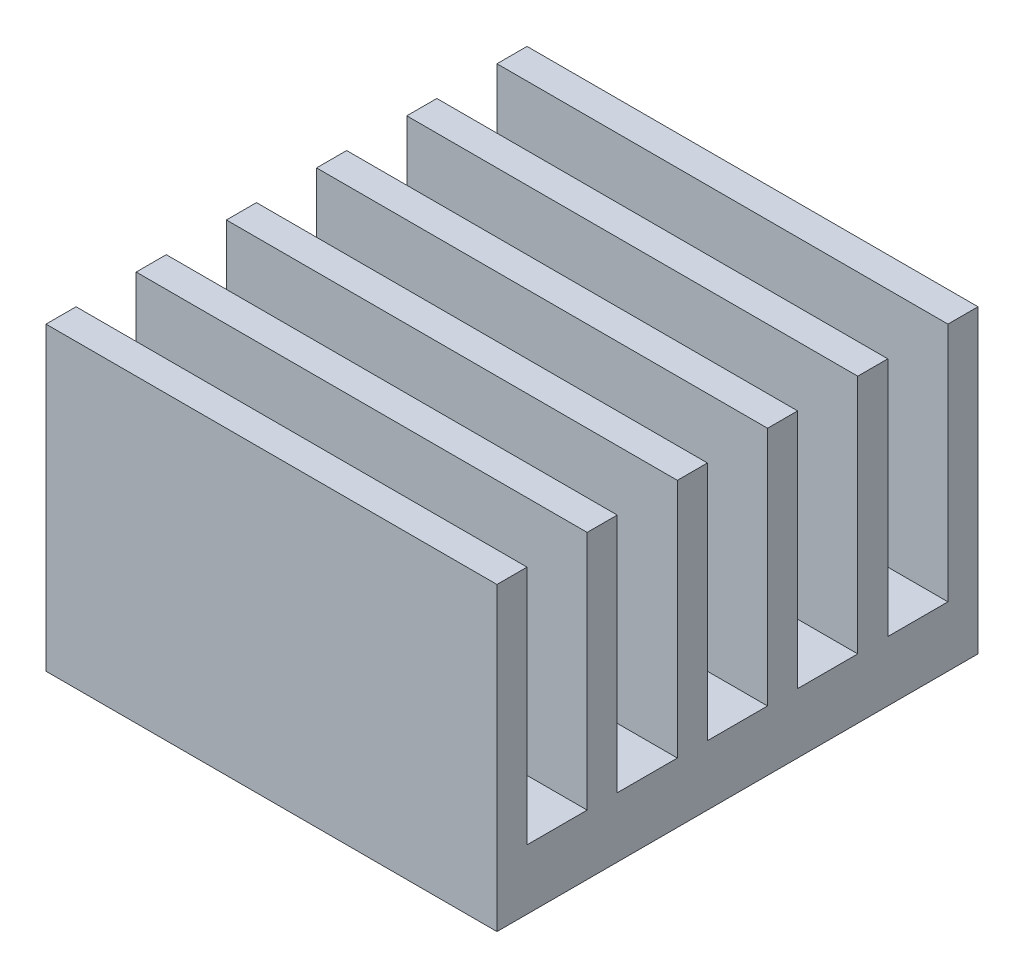
ISO-10303-21;
HEADER;
FILE_DESCRIPTION(('STEP AP214'),'2;1');
FILE_NAME('part.step','',(''),(''),'','','');
FILE_SCHEMA(('AUTOMOTIVE_DESIGN { 1 0 10303 214 1 1 1 1 }'));
ENDSEC;
DATA;
#1=APPLICATION_CONTEXT('core data for automotive mechanical design processes');
#2=APPLICATION_PROTOCOL_DEFINITION('international standard','automotive_design',2000,#1);
#3=PRODUCT_CONTEXT('',#1,'mechanical');
#4=PRODUCT('Part','Part','',(#3));
#5=PRODUCT_RELATED_PRODUCT_CATEGORY('part','',(#4));
#6=PRODUCT_DEFINITION_FORMATION('','',#4);
#7=PRODUCT_DEFINITION_CONTEXT('part definition',#1,'design');
#8=PRODUCT_DEFINITION('design','',#6,#7);
#9=PRODUCT_DEFINITION_SHAPE('','',#8);
#10=(LENGTH_UNIT() NAMED_UNIT(*) SI_UNIT(.MILLI.,.METRE.));
#11=(NAMED_UNIT(*) PLANE_ANGLE_UNIT() SI_UNIT($,.RADIAN.));
#12=(NAMED_UNIT(*) SI_UNIT($,.STERADIAN.) SOLID_ANGLE_UNIT());
#13=UNCERTAINTY_MEASURE_WITH_UNIT(LENGTH_MEASURE(1.E-05),#10,'distance_accuracy_value','');
#14=(GEOMETRIC_REPRESENTATION_CONTEXT(3) GLOBAL_UNCERTAINTY_ASSIGNED_CONTEXT((#13)) GLOBAL_UNIT_ASSIGNED_CONTEXT((#10,
#11,#12)) REPRESENTATION_CONTEXT('',''));
#15=CARTESIAN_POINT('',(0.,0.,0.));
#16=DIRECTION('',(0.,0.,1.));
#17=DIRECTION('',(1.,0.,0.));
#18=AXIS2_PLACEMENT_3D('',#15,#16,#17);
#19=CARTESIAN_POINT('',(0.,50.,0.));
#20=DIRECTION('',(0.,1.,0.));
#21=DIRECTION('',(0.,0.,1.));
#22=AXIS2_PLACEMENT_3D('',#19,#20,#21);
#23=PLANE('',#22);
#24=DIRECTION('',(-1.,0.,0.));
#25=VECTOR('',#24,1.);
#26=CARTESIAN_POINT('',(-37.5,50.,-35.));
#27=LINE('',#26,#25);
#28=CARTESIAN_POINT('',(37.5,50.,-35.));
#29=VERTEX_POINT('',#28);
#30=CARTESIAN_POINT('',(-37.5,50.,-35.));
#31=VERTEX_POINT('',#30);
#32=EDGE_CURVE('E221',#29,#31,#27,.T.);
#33=ORIENTED_EDGE('',*,*,#32,.F.);
#34=DIRECTION('',(0.,0.,-1.));
#35=VECTOR('',#34,1.);
#36=CARTESIAN_POINT('',(37.5,50.,40.));
#37=LINE('',#36,#35);
#38=CARTESIAN_POINT('',(37.5,50.,-40.));
#39=VERTEX_POINT('',#38);
#40=EDGE_CURVE('E337',#29,#39,#37,.T.);
#41=ORIENTED_EDGE('',*,*,#40,.T.);
#42=DIRECTION('',(-1.,0.,0.));
#43=VECTOR('',#42,1.);
#44=CARTESIAN_POINT('',(37.5,50.,-40.));
#45=LINE('',#44,#43);
#46=CARTESIAN_POINT('',(-37.5,50.,-40.));
#47=VERTEX_POINT('',#46);
#48=EDGE_CURVE('E341',#39,#47,#45,.T.);
#49=ORIENTED_EDGE('',*,*,#48,.T.);
#50=DIRECTION('',(0.,0.,1.));
#51=VECTOR('',#50,1.);
#52=CARTESIAN_POINT('',(-37.5,50.,40.));
#53=LINE('',#52,#51);
#54=EDGE_CURVE('E331',#47,#31,#53,.T.);
#55=ORIENTED_EDGE('',*,*,#54,.T.);
#56=EDGE_LOOP('',(#33,#41,#49,#55));
#57=FACE_BOUND('',#56,.T.);
#58=ADVANCED_FACE('F41',(#57),#23,.T.);
#59=DIRECTION('',(1.,0.,0.));
#60=VECTOR('',#59,1.);
#61=CARTESIAN_POINT('',(-37.5,50.,-25.));
#62=LINE('',#61,#60);
#63=CARTESIAN_POINT('',(-37.5,50.,-25.));
#64=VERTEX_POINT('',#63);
#65=CARTESIAN_POINT('',(37.5,50.,-25.));
#66=VERTEX_POINT('',#65);
#67=EDGE_CURVE('E249',#64,#66,#62,.T.);
#68=ORIENTED_EDGE('',*,*,#67,.F.);
#69=CARTESIAN_POINT('',(-37.5,50.,-20.));
#70=VERTEX_POINT('',#69);
#71=EDGE_CURVE('E226',#64,#70,#53,.T.);
#72=ORIENTED_EDGE('',*,*,#71,.T.);
#73=DIRECTION('',(-1.,0.,0.));
#74=VECTOR('',#73,1.);
#75=CARTESIAN_POINT('',(-37.5,50.,-20.));
#76=LINE('',#75,#74);
#77=CARTESIAN_POINT('',(37.5,50.,-20.));
#78=VERTEX_POINT('',#77);
#79=EDGE_CURVE('E244',#78,#70,#76,.T.);
#80=ORIENTED_EDGE('',*,*,#79,.F.);
#81=EDGE_CURVE('E382',#78,#66,#37,.T.);
#82=ORIENTED_EDGE('',*,*,#81,.T.);
#83=EDGE_LOOP('',(#68,#72,#80,#82));
#84=FACE_BOUND('',#83,.T.);
#85=ADVANCED_FACE('F432',(#84),#23,.T.);
#86=DIRECTION('',(1.,0.,0.));
#87=VECTOR('',#86,1.);
#88=CARTESIAN_POINT('',(-37.5,50.,-10.));
#89=LINE('',#88,#87);
#90=CARTESIAN_POINT('',(-37.5,50.,-10.));
#91=VERTEX_POINT('',#90);
#92=CARTESIAN_POINT('',(37.5,50.,-10.));
#93=VERTEX_POINT('',#92);
#94=EDGE_CURVE('E246',#91,#93,#89,.T.);
#95=ORIENTED_EDGE('',*,*,#94,.F.);
#96=CARTESIAN_POINT('',(-37.5,50.,-5.00000000000001));
#97=VERTEX_POINT('',#96);
#98=EDGE_CURVE('E419',#91,#97,#53,.T.);
#99=ORIENTED_EDGE('',*,*,#98,.T.);
#100=DIRECTION('',(-1.,0.,0.));
#101=VECTOR('',#100,1.);
#102=CARTESIAN_POINT('',(-37.5,50.,-5.00000000000001));
#103=LINE('',#102,#101);
#104=CARTESIAN_POINT('',(37.5,50.,-5.));
#105=VERTEX_POINT('',#104);
#106=EDGE_CURVE('E271',#105,#97,#103,.T.);
#107=ORIENTED_EDGE('',*,*,#106,.F.);
#108=EDGE_CURVE('E384',#105,#93,#37,.T.);
#109=ORIENTED_EDGE('',*,*,#108,.T.);
#110=EDGE_LOOP('',(#95,#99,#107,#109));
#111=FACE_BOUND('',#110,.T.);
#112=ADVANCED_FACE('F438',(#111),#23,.T.);
#113=DIRECTION('',(1.,0.,0.));
#114=VECTOR('',#113,1.);
#115=CARTESIAN_POINT('',(-37.5,50.,4.99999999999999));
#116=LINE('',#115,#114);
#117=CARTESIAN_POINT('',(-37.5,50.,4.99999999999999));
#118=VERTEX_POINT('',#117);
#119=CARTESIAN_POINT('',(37.5,50.,4.99999999999999));
#120=VERTEX_POINT('',#119);
#121=EDGE_CURVE('E243',#118,#120,#116,.T.);
#122=ORIENTED_EDGE('',*,*,#121,.F.);
#123=CARTESIAN_POINT('',(-37.5,50.,9.99999999999999));
#124=VERTEX_POINT('',#123);
#125=EDGE_CURVE('E417',#118,#124,#53,.T.);
#126=ORIENTED_EDGE('',*,*,#125,.T.);
#127=DIRECTION('',(-1.,0.,0.));
#128=VECTOR('',#127,1.);
#129=CARTESIAN_POINT('',(-37.5,50.,9.99999999999999));
#130=LINE('',#129,#128);
#131=CARTESIAN_POINT('',(37.5,50.,9.99999999999999));
#132=VERTEX_POINT('',#131);
#133=EDGE_CURVE('E295',#132,#124,#130,.T.);
#134=ORIENTED_EDGE('',*,*,#133,.F.);
#135=EDGE_CURVE('E389',#132,#120,#37,.T.);
#136=ORIENTED_EDGE('',*,*,#135,.T.);
#137=EDGE_LOOP('',(#122,#126,#134,#136));
#138=FACE_BOUND('',#137,.T.);
#139=ADVANCED_FACE('F448',(#138),#23,.T.);
#140=DIRECTION('',(1.,0.,0.));
#141=VECTOR('',#140,1.);
#142=CARTESIAN_POINT('',(-37.5,50.,20.));
#143=LINE('',#142,#141);
#144=CARTESIAN_POINT('',(-37.5,50.,20.));
#145=VERTEX_POINT('',#144);
#146=CARTESIAN_POINT('',(37.5,50.,20.));
#147=VERTEX_POINT('',#146);
#148=EDGE_CURVE('E270',#145,#147,#143,.T.);
#149=ORIENTED_EDGE('',*,*,#148,.F.);
#150=CARTESIAN_POINT('',(-37.5,50.,25.));
#151=VERTEX_POINT('',#150);
#152=EDGE_CURVE('E415',#145,#151,#53,.T.);
#153=ORIENTED_EDGE('',*,*,#152,.T.);
#154=DIRECTION('',(-1.,0.,0.));
#155=VECTOR('',#154,1.);
#156=CARTESIAN_POINT('',(-37.5,50.,25.));
#157=LINE('',#156,#155);
#158=CARTESIAN_POINT('',(37.5,50.,25.));
#159=VERTEX_POINT('',#158);
#160=EDGE_CURVE('E318',#159,#151,#157,.T.);
#161=ORIENTED_EDGE('',*,*,#160,.F.);
#162=EDGE_CURVE('E342',#159,#147,#37,.T.);
#163=ORIENTED_EDGE('',*,*,#162,.T.);
#164=EDGE_LOOP('',(#149,#153,#161,#163));
#165=FACE_BOUND('',#164,.T.);
#166=ADVANCED_FACE('F403',(#165),#23,.T.);
#167=CARTESIAN_POINT('',(-37.5,50.,40.));
#168=DIRECTION('',(1.,0.,0.));
#169=DIRECTION('',(0.,0.,-1.));
#170=AXIS2_PLACEMENT_3D('',#167,#168,#169);
#171=PLANE('',#170);
#172=DIRECTION('',(0.,0.,1.));
#173=VECTOR('',#172,1.);
#174=CARTESIAN_POINT('',(-37.5,10.,-25.));
#175=LINE('',#174,#173);
#176=CARTESIAN_POINT('',(-37.5,10.,-35.));
#177=VERTEX_POINT('',#176);
#178=CARTESIAN_POINT('',(-37.5,10.,-25.));
#179=VERTEX_POINT('',#178);
#180=EDGE_CURVE('E212',#177,#179,#175,.T.);
#181=ORIENTED_EDGE('',*,*,#180,.F.);
#182=DIRECTION('',(0.,1.,0.));
#183=VECTOR('',#182,1.);
#184=CARTESIAN_POINT('',(-37.5,10.,-35.));
#185=LINE('',#184,#183);
#186=EDGE_CURVE('E349',#177,#31,#185,.T.);
#187=ORIENTED_EDGE('',*,*,#186,.T.);
#188=ORIENTED_EDGE('',*,*,#54,.F.);
#189=DIRECTION('',(0.,-1.,0.));
#190=VECTOR('',#189,1.);
#191=CARTESIAN_POINT('',(-37.5,50.,-40.));
#192=LINE('',#191,#190);
#193=CARTESIAN_POINT('',(-37.5,0.,-40.));
#194=VERTEX_POINT('',#193);
#195=EDGE_CURVE('E344',#47,#194,#192,.T.);
#196=ORIENTED_EDGE('',*,*,#195,.T.);
#197=DIRECTION('',(0.,0.,1.));
#198=VECTOR('',#197,1.);
#199=CARTESIAN_POINT('',(-37.5,0.,40.));
#200=LINE('',#199,#198);
#201=CARTESIAN_POINT('',(-37.5,0.,40.));
#202=VERTEX_POINT('',#201);
#203=EDGE_CURVE('E345',#194,#202,#200,.T.);
#204=ORIENTED_EDGE('',*,*,#203,.T.);
#205=DIRECTION('',(0.,-1.,0.));
#206=VECTOR('',#205,1.);
#207=CARTESIAN_POINT('',(-37.5,50.,40.));
#208=LINE('',#207,#206);
#209=CARTESIAN_POINT('',(-37.5,50.,40.));
#210=VERTEX_POINT('',#209);
#211=EDGE_CURVE('E11',#210,#202,#208,.T.);
#212=ORIENTED_EDGE('',*,*,#211,.F.);
#213=CARTESIAN_POINT('',(-37.5,50.,35.));
#214=VERTEX_POINT('',#213);
#215=EDGE_CURVE('E335',#214,#210,#53,.T.);
#216=ORIENTED_EDGE('',*,*,#215,.F.);
#217=DIRECTION('',(0.,1.,0.));
#218=VECTOR('',#217,1.);
#219=CARTESIAN_POINT('',(-37.5,10.,35.));
#220=LINE('',#219,#218);
#221=CARTESIAN_POINT('',(-37.5,10.,35.));
#222=VERTEX_POINT('',#221);
#223=EDGE_CURVE('E56',#222,#214,#220,.T.);
#224=ORIENTED_EDGE('',*,*,#223,.F.);
#225=DIRECTION('',(0.,0.,1.));
#226=VECTOR('',#225,1.);
#227=CARTESIAN_POINT('',(-37.5,10.,35.));
#228=LINE('',#227,#226);
#229=CARTESIAN_POINT('',(-37.5,10.,25.));
#230=VERTEX_POINT('',#229);
#231=EDGE_CURVE('E320',#230,#222,#228,.T.);
#232=ORIENTED_EDGE('',*,*,#231,.F.);
#233=DIRECTION('',(0.,1.,0.));
#234=VECTOR('',#233,1.);
#235=CARTESIAN_POINT('',(-37.5,10.,25.));
#236=LINE('',#235,#234);
#237=EDGE_CURVE('E315',#230,#151,#236,.T.);
#238=ORIENTED_EDGE('',*,*,#237,.T.);
#239=ORIENTED_EDGE('',*,*,#152,.F.);
#240=DIRECTION('',(0.,1.,0.));
#241=VECTOR('',#240,1.);
#242=CARTESIAN_POINT('',(-37.5,10.,20.));
#243=LINE('',#242,#241);
#244=CARTESIAN_POINT('',(-37.5,10.,20.));
#245=VERTEX_POINT('',#244);
#246=EDGE_CURVE('E64',#245,#145,#243,.T.);
#247=ORIENTED_EDGE('',*,*,#246,.F.);
#248=DIRECTION('',(0.,0.,1.));
#249=VECTOR('',#248,1.);
#250=CARTESIAN_POINT('',(-37.5,10.,20.));
#251=LINE('',#250,#249);
#252=CARTESIAN_POINT('',(-37.5,10.,9.99999999999999));
#253=VERTEX_POINT('',#252);
#254=EDGE_CURVE('E297',#253,#245,#251,.T.);
#255=ORIENTED_EDGE('',*,*,#254,.F.);
#256=DIRECTION('',(0.,1.,0.));
#257=VECTOR('',#256,1.);
#258=CARTESIAN_POINT('',(-37.5,10.,9.99999999999999));
#259=LINE('',#258,#257);
#260=EDGE_CURVE('E291',#253,#124,#259,.T.);
#261=ORIENTED_EDGE('',*,*,#260,.T.);
#262=ORIENTED_EDGE('',*,*,#125,.F.);
#263=DIRECTION('',(0.,1.,0.));
#264=VECTOR('',#263,1.);
#265=CARTESIAN_POINT('',(-37.5,10.,4.99999999999999));
#266=LINE('',#265,#264);
#267=CARTESIAN_POINT('',(-37.5,10.,4.99999999999999));
#268=VERTEX_POINT('',#267);
#269=EDGE_CURVE('E259',#268,#118,#266,.T.);
#270=ORIENTED_EDGE('',*,*,#269,.F.);
#271=DIRECTION('',(0.,0.,1.));
#272=VECTOR('',#271,1.);
#273=CARTESIAN_POINT('',(-37.5,10.,4.99999999999999));
#274=LINE('',#273,#272);
#275=CARTESIAN_POINT('',(-37.5,10.,-5.00000000000001));
#276=VERTEX_POINT('',#275);
#277=EDGE_CURVE('E273',#276,#268,#274,.T.);
#278=ORIENTED_EDGE('',*,*,#277,.F.);
#279=DIRECTION('',(0.,1.,0.));
#280=VECTOR('',#279,1.);
#281=CARTESIAN_POINT('',(-37.5,10.,-5.00000000000001));
#282=LINE('',#281,#280);
#283=EDGE_CURVE('E267',#276,#97,#282,.T.);
#284=ORIENTED_EDGE('',*,*,#283,.T.);
#285=ORIENTED_EDGE('',*,*,#98,.F.);
#286=DIRECTION('',(0.,1.,0.));
#287=VECTOR('',#286,1.);
#288=CARTESIAN_POINT('',(-37.5,10.,-10.));
#289=LINE('',#288,#287);
#290=CARTESIAN_POINT('',(-37.5,10.,-10.));
#291=VERTEX_POINT('',#290);
#292=EDGE_CURVE('E233',#291,#91,#289,.T.);
#293=ORIENTED_EDGE('',*,*,#292,.F.);
#294=DIRECTION('',(0.,0.,1.));
#295=VECTOR('',#294,1.);
#296=CARTESIAN_POINT('',(-37.5,10.,-10.));
#297=LINE('',#296,#295);
#298=CARTESIAN_POINT('',(-37.5,10.,-20.));
#299=VERTEX_POINT('',#298);
#300=EDGE_CURVE('E247',#299,#291,#297,.T.);
#301=ORIENTED_EDGE('',*,*,#300,.F.);
#302=DIRECTION('',(0.,1.,0.));
#303=VECTOR('',#302,1.);
#304=CARTESIAN_POINT('',(-37.5,10.,-20.));
#305=LINE('',#304,#303);
#306=EDGE_CURVE('E241',#299,#70,#305,.T.);
#307=ORIENTED_EDGE('',*,*,#306,.T.);
#308=ORIENTED_EDGE('',*,*,#71,.F.);
#309=DIRECTION('',(0.,1.,0.));
#310=VECTOR('',#309,1.);
#311=CARTESIAN_POINT('',(-37.5,10.,-25.));
#312=LINE('',#311,#310);
#313=EDGE_CURVE('E205',#179,#64,#312,.T.);
#314=ORIENTED_EDGE('',*,*,#313,.F.);
#315=EDGE_LOOP('',(#181,#187,#188,#196,#204,#212,#216,#224,#232,#238,#239,#247,#255,#261,#262,
#270,#278,#284,#285,#293,#301,#307,#308,#314));
#316=FACE_BOUND('',#315,.T.);
#317=ADVANCED_FACE('F43',(#316),#171,.F.);
#318=CARTESIAN_POINT('',(37.5,50.,40.));
#319=DIRECTION('',(0.,0.,-1.));
#320=DIRECTION('',(-1.,0.,0.));
#321=AXIS2_PLACEMENT_3D('',#318,#319,#320);
#322=PLANE('',#321);
#323=DIRECTION('',(1.,0.,0.));
#324=VECTOR('',#323,1.);
#325=CARTESIAN_POINT('',(37.5,0.,40.));
#326=LINE('',#325,#324);
#327=CARTESIAN_POINT('',(37.5,0.,40.));
#328=VERTEX_POINT('',#327);
#329=EDGE_CURVE('E348',#202,#328,#326,.T.);
#330=ORIENTED_EDGE('',*,*,#329,.T.);
#331=DIRECTION('',(0.,-1.,0.));
#332=VECTOR('',#331,1.);
#333=CARTESIAN_POINT('',(37.5,50.,40.));
#334=LINE('',#333,#332);
#335=CARTESIAN_POINT('',(37.5,50.,40.));
#336=VERTEX_POINT('',#335);
#337=EDGE_CURVE('E49',#336,#328,#334,.T.);
#338=ORIENTED_EDGE('',*,*,#337,.F.);
#339=DIRECTION('',(1.,0.,0.));
#340=VECTOR('',#339,1.);
#341=CARTESIAN_POINT('',(37.5,50.,40.));
#342=LINE('',#341,#340);
#343=EDGE_CURVE('E334',#210,#336,#342,.T.);
#344=ORIENTED_EDGE('',*,*,#343,.F.);
#345=ORIENTED_EDGE('',*,*,#211,.T.);
#346=EDGE_LOOP('',(#330,#338,#344,#345));
#347=FACE_BOUND('',#346,.T.);
#348=ADVANCED_FACE('F423',(#347),#322,.F.);
#349=CARTESIAN_POINT('',(37.5,50.,40.));
#350=DIRECTION('',(-1.,0.,0.));
#351=DIRECTION('',(0.,0.,1.));
#352=AXIS2_PLACEMENT_3D('',#349,#350,#351);
#353=PLANE('',#352);
#354=ORIENTED_EDGE('',*,*,#40,.F.);
#355=DIRECTION('',(0.,1.,0.));
#356=VECTOR('',#355,1.);
#357=CARTESIAN_POINT('',(37.5,10.,-35.));
#358=LINE('',#357,#356);
#359=CARTESIAN_POINT('',(37.5,10.,-35.));
#360=VERTEX_POINT('',#359);
#361=EDGE_CURVE('E228',#360,#29,#358,.T.);
#362=ORIENTED_EDGE('',*,*,#361,.F.);
#363=DIRECTION('',(0.,0.,-1.));
#364=VECTOR('',#363,1.);
#365=CARTESIAN_POINT('',(37.5,10.,-25.));
#366=LINE('',#365,#364);
#367=CARTESIAN_POINT('',(37.5,10.,-25.));
#368=VERTEX_POINT('',#367);
#369=EDGE_CURVE('E211',#368,#360,#366,.T.);
#370=ORIENTED_EDGE('',*,*,#369,.F.);
#371=DIRECTION('',(0.,1.,0.));
#372=VECTOR('',#371,1.);
#373=CARTESIAN_POINT('',(37.5,10.,-25.));
#374=LINE('',#373,#372);
#375=EDGE_CURVE('E208',#368,#66,#374,.T.);
#376=ORIENTED_EDGE('',*,*,#375,.T.);
#377=ORIENTED_EDGE('',*,*,#81,.F.);
#378=DIRECTION('',(0.,1.,0.));
#379=VECTOR('',#378,1.);
#380=CARTESIAN_POINT('',(37.5,10.,-20.));
#381=LINE('',#380,#379);
#382=CARTESIAN_POINT('',(37.5,10.,-20.));
#383=VERTEX_POINT('',#382);
#384=EDGE_CURVE('E239',#383,#78,#381,.T.);
#385=ORIENTED_EDGE('',*,*,#384,.F.);
#386=DIRECTION('',(0.,0.,-1.));
#387=VECTOR('',#386,1.);
#388=CARTESIAN_POINT('',(37.5,10.,-10.));
#389=LINE('',#388,#387);
#390=CARTESIAN_POINT('',(37.5,10.,-10.));
#391=VERTEX_POINT('',#390);
#392=EDGE_CURVE('E252',#391,#383,#389,.T.);
#393=ORIENTED_EDGE('',*,*,#392,.F.);
#394=DIRECTION('',(0.,1.,0.));
#395=VECTOR('',#394,1.);
#396=CARTESIAN_POINT('',(37.5,10.,-10.));
#397=LINE('',#396,#395);
#398=EDGE_CURVE('E236',#391,#93,#397,.T.);
#399=ORIENTED_EDGE('',*,*,#398,.T.);
#400=ORIENTED_EDGE('',*,*,#108,.F.);
#401=DIRECTION('',(0.,1.,0.));
#402=VECTOR('',#401,1.);
#403=CARTESIAN_POINT('',(37.5,10.,-5.));
#404=LINE('',#403,#402);
#405=CARTESIAN_POINT('',(37.5,10.,-5.));
#406=VERTEX_POINT('',#405);
#407=EDGE_CURVE('E265',#406,#105,#404,.T.);
#408=ORIENTED_EDGE('',*,*,#407,.F.);
#409=DIRECTION('',(0.,0.,-1.));
#410=VECTOR('',#409,1.);
#411=CARTESIAN_POINT('',(37.5,10.,4.99999999999999));
#412=LINE('',#411,#410);
#413=CARTESIAN_POINT('',(37.5,10.,4.99999999999999));
#414=VERTEX_POINT('',#413);
#415=EDGE_CURVE('E277',#414,#406,#412,.T.);
#416=ORIENTED_EDGE('',*,*,#415,.F.);
#417=DIRECTION('',(0.,1.,0.));
#418=VECTOR('',#417,1.);
#419=CARTESIAN_POINT('',(37.5,10.,4.99999999999999));
#420=LINE('',#419,#418);
#421=EDGE_CURVE('E262',#414,#120,#420,.T.);
#422=ORIENTED_EDGE('',*,*,#421,.T.);
#423=ORIENTED_EDGE('',*,*,#135,.F.);
#424=DIRECTION('',(0.,1.,0.));
#425=VECTOR('',#424,1.);
#426=CARTESIAN_POINT('',(37.5,10.,9.99999999999999));
#427=LINE('',#426,#425);
#428=CARTESIAN_POINT('',(37.5,10.,9.99999999999999));
#429=VERTEX_POINT('',#428);
#430=EDGE_CURVE('E289',#429,#132,#427,.T.);
#431=ORIENTED_EDGE('',*,*,#430,.F.);
#432=DIRECTION('',(0.,0.,-1.));
#433=VECTOR('',#432,1.);
#434=CARTESIAN_POINT('',(37.5,10.,20.));
#435=LINE('',#434,#433);
#436=CARTESIAN_POINT('',(37.5,10.,20.));
#437=VERTEX_POINT('',#436);
#438=EDGE_CURVE('E301',#437,#429,#435,.T.);
#439=ORIENTED_EDGE('',*,*,#438,.F.);
#440=DIRECTION('',(0.,1.,0.));
#441=VECTOR('',#440,1.);
#442=CARTESIAN_POINT('',(37.5,10.,20.));
#443=LINE('',#442,#441);
#444=EDGE_CURVE('E286',#437,#147,#443,.T.);
#445=ORIENTED_EDGE('',*,*,#444,.T.);
#446=ORIENTED_EDGE('',*,*,#162,.F.);
#447=DIRECTION('',(0.,1.,0.));
#448=VECTOR('',#447,1.);
#449=CARTESIAN_POINT('',(37.5,10.,25.));
#450=LINE('',#449,#448);
#451=CARTESIAN_POINT('',(37.5,10.,25.));
#452=VERTEX_POINT('',#451);
#453=EDGE_CURVE('E313',#452,#159,#450,.T.);
#454=ORIENTED_EDGE('',*,*,#453,.F.);
#455=DIRECTION('',(0.,0.,-1.));
#456=VECTOR('',#455,1.);
#457=CARTESIAN_POINT('',(37.5,10.,35.));
#458=LINE('',#457,#456);
#459=CARTESIAN_POINT('',(37.5,10.,35.));
#460=VERTEX_POINT('',#459);
#461=EDGE_CURVE('E324',#460,#452,#458,.T.);
#462=ORIENTED_EDGE('',*,*,#461,.F.);
#463=DIRECTION('',(0.,1.,0.));
#464=VECTOR('',#463,1.);
#465=CARTESIAN_POINT('',(37.5,10.,35.));
#466=LINE('',#465,#464);
#467=CARTESIAN_POINT('',(37.5,50.,35.));
#468=VERTEX_POINT('',#467);
#469=EDGE_CURVE('E310',#460,#468,#466,.T.);
#470=ORIENTED_EDGE('',*,*,#469,.T.);
#471=EDGE_CURVE('E338',#336,#468,#37,.T.);
#472=ORIENTED_EDGE('',*,*,#471,.F.);
#473=ORIENTED_EDGE('',*,*,#337,.T.);
#474=DIRECTION('',(0.,0.,-1.));
#475=VECTOR('',#474,1.);
#476=CARTESIAN_POINT('',(37.5,0.,40.));
#477=LINE('',#476,#475);
#478=CARTESIAN_POINT('',(37.5,0.,-40.));
#479=VERTEX_POINT('',#478);
#480=EDGE_CURVE('E351',#328,#479,#477,.T.);
#481=ORIENTED_EDGE('',*,*,#480,.T.);
#482=DIRECTION('',(0.,-1.,0.));
#483=VECTOR('',#482,1.);
#484=CARTESIAN_POINT('',(37.5,50.,-40.));
#485=LINE('',#484,#483);
#486=EDGE_CURVE('E357',#39,#479,#485,.T.);
#487=ORIENTED_EDGE('',*,*,#486,.F.);
#488=EDGE_LOOP('',(#354,#362,#370,#376,#377,#385,#393,#399,#400,#408,#416,#422,#423,#431,#439,
#445,#446,#454,#462,#470,#472,#473,#481,#487));
#489=FACE_BOUND('',#488,.T.);
#490=ADVANCED_FACE('F365',(#489),#353,.F.);
#491=CARTESIAN_POINT('',(37.5,50.,-40.));
#492=DIRECTION('',(0.,0.,1.));
#493=DIRECTION('',(1.,0.,0.));
#494=AXIS2_PLACEMENT_3D('',#491,#492,#493);
#495=PLANE('',#494);
#496=DIRECTION('',(-1.,0.,0.));
#497=VECTOR('',#496,1.);
#498=CARTESIAN_POINT('',(37.5,0.,-40.));
#499=LINE('',#498,#497);
#500=EDGE_CURVE('E353',#479,#194,#499,.T.);
#501=ORIENTED_EDGE('',*,*,#500,.T.);
#502=ORIENTED_EDGE('',*,*,#195,.F.);
#503=ORIENTED_EDGE('',*,*,#48,.F.);
#504=ORIENTED_EDGE('',*,*,#486,.T.);
#505=EDGE_LOOP('',(#501,#502,#503,#504));
#506=FACE_BOUND('',#505,.T.);
#507=ADVANCED_FACE('F375',(#506),#495,.F.);
#508=DIRECTION('',(1.,0.,0.));
#509=VECTOR('',#508,1.);
#510=CARTESIAN_POINT('',(-37.5,50.,35.));
#511=LINE('',#510,#509);
#512=EDGE_CURVE('E294',#214,#468,#511,.T.);
#513=ORIENTED_EDGE('',*,*,#512,.F.);
#514=ORIENTED_EDGE('',*,*,#215,.T.);
#515=ORIENTED_EDGE('',*,*,#343,.T.);
#516=ORIENTED_EDGE('',*,*,#471,.T.);
#517=EDGE_LOOP('',(#513,#514,#515,#516));
#518=FACE_BOUND('',#517,.T.);
#519=ADVANCED_FACE('F422',(#518),#23,.T.);
#520=CARTESIAN_POINT('',(0.,0.,0.));
#521=DIRECTION('',(0.,1.,0.));
#522=DIRECTION('',(0.,0.,1.));
#523=AXIS2_PLACEMENT_3D('',#520,#521,#522);
#524=PLANE('',#523);
#525=ORIENTED_EDGE('',*,*,#203,.F.);
#526=ORIENTED_EDGE('',*,*,#500,.F.);
#527=ORIENTED_EDGE('',*,*,#480,.F.);
#528=ORIENTED_EDGE('',*,*,#329,.F.);
#529=EDGE_LOOP('',(#525,#526,#527,#528));
#530=FACE_BOUND('',#529,.T.);
#531=ADVANCED_FACE('F372',(#530),#524,.F.);
#532=CARTESIAN_POINT('',(-37.5,10.,25.));
#533=DIRECTION('',(0.,0.,-1.));
#534=DIRECTION('',(-1.,0.,0.));
#535=AXIS2_PLACEMENT_3D('',#532,#533,#534);
#536=PLANE('',#535);
#537=ORIENTED_EDGE('',*,*,#160,.T.);
#538=ORIENTED_EDGE('',*,*,#237,.F.);
#539=DIRECTION('',(-1.,0.,0.));
#540=VECTOR('',#539,1.);
#541=CARTESIAN_POINT('',(-37.5,10.,25.));
#542=LINE('',#541,#540);
#543=EDGE_CURVE('E309',#452,#230,#542,.T.);
#544=ORIENTED_EDGE('',*,*,#543,.F.);
#545=ORIENTED_EDGE('',*,*,#453,.T.);
#546=EDGE_LOOP('',(#537,#538,#544,#545));
#547=FACE_BOUND('',#546,.T.);
#548=ADVANCED_FACE('F445',(#547),#536,.F.);
#549=CARTESIAN_POINT('',(-37.5,10.,35.));
#550=DIRECTION('',(0.,0.,1.));
#551=DIRECTION('',(1.,0.,0.));
#552=AXIS2_PLACEMENT_3D('',#549,#550,#551);
#553=PLANE('',#552);
#554=ORIENTED_EDGE('',*,*,#512,.T.);
#555=ORIENTED_EDGE('',*,*,#469,.F.);
#556=DIRECTION('',(1.,0.,0.));
#557=VECTOR('',#556,1.);
#558=CARTESIAN_POINT('',(-37.5,10.,35.));
#559=LINE('',#558,#557);
#560=EDGE_CURVE('E326',#222,#460,#559,.T.);
#561=ORIENTED_EDGE('',*,*,#560,.F.);
#562=ORIENTED_EDGE('',*,*,#223,.T.);
#563=EDGE_LOOP('',(#554,#555,#561,#562));
#564=FACE_BOUND('',#563,.T.);
#565=ADVANCED_FACE('F505',(#564),#553,.F.);
#566=CARTESIAN_POINT('',(0.,10.,0.));
#567=DIRECTION('',(0.,-1.,0.));
#568=DIRECTION('',(0.,0.,-1.));
#569=AXIS2_PLACEMENT_3D('',#566,#567,#568);
#570=PLANE('',#569);
#571=ORIENTED_EDGE('',*,*,#231,.T.);
#572=ORIENTED_EDGE('',*,*,#560,.T.);
#573=ORIENTED_EDGE('',*,*,#461,.T.);
#574=ORIENTED_EDGE('',*,*,#543,.T.);
#575=EDGE_LOOP('',(#571,#572,#573,#574));
#576=FACE_BOUND('',#575,.T.);
#577=ADVANCED_FACE('F503',(#576),#570,.F.);
#578=CARTESIAN_POINT('',(-37.5,10.,9.99999999999999));
#579=DIRECTION('',(0.,0.,-1.));
#580=DIRECTION('',(-1.,0.,0.));
#581=AXIS2_PLACEMENT_3D('',#578,#579,#580);
#582=PLANE('',#581);
#583=ORIENTED_EDGE('',*,*,#133,.T.);
#584=ORIENTED_EDGE('',*,*,#260,.F.);
#585=DIRECTION('',(-1.,0.,0.));
#586=VECTOR('',#585,1.);
#587=CARTESIAN_POINT('',(-37.5,10.,9.99999999999999));
#588=LINE('',#587,#586);
#589=EDGE_CURVE('E285',#429,#253,#588,.T.);
#590=ORIENTED_EDGE('',*,*,#589,.F.);
#591=ORIENTED_EDGE('',*,*,#430,.T.);
#592=EDGE_LOOP('',(#583,#584,#590,#591));
#593=FACE_BOUND('',#592,.T.);
#594=ADVANCED_FACE('F460',(#593),#582,.F.);
#595=CARTESIAN_POINT('',(-37.5,10.,20.));
#596=DIRECTION('',(0.,0.,1.));
#597=DIRECTION('',(1.,0.,0.));
#598=AXIS2_PLACEMENT_3D('',#595,#596,#597);
#599=PLANE('',#598);
#600=ORIENTED_EDGE('',*,*,#148,.T.);
#601=ORIENTED_EDGE('',*,*,#444,.F.);
#602=DIRECTION('',(1.,0.,0.));
#603=VECTOR('',#602,1.);
#604=CARTESIAN_POINT('',(-37.5,10.,20.));
#605=LINE('',#604,#603);
#606=EDGE_CURVE('E303',#245,#437,#605,.T.);
#607=ORIENTED_EDGE('',*,*,#606,.F.);
#608=ORIENTED_EDGE('',*,*,#246,.T.);
#609=EDGE_LOOP('',(#600,#601,#607,#608));
#610=FACE_BOUND('',#609,.T.);
#611=ADVANCED_FACE('F410',(#610),#599,.F.);
#612=CARTESIAN_POINT('',(0.,10.,0.));
#613=DIRECTION('',(0.,-1.,0.));
#614=DIRECTION('',(0.,0.,-1.));
#615=AXIS2_PLACEMENT_3D('',#612,#613,#614);
#616=PLANE('',#615);
#617=ORIENTED_EDGE('',*,*,#254,.T.);
#618=ORIENTED_EDGE('',*,*,#606,.T.);
#619=ORIENTED_EDGE('',*,*,#438,.T.);
#620=ORIENTED_EDGE('',*,*,#589,.T.);
#621=EDGE_LOOP('',(#617,#618,#619,#620));
#622=FACE_BOUND('',#621,.T.);
#623=ADVANCED_FACE('F412',(#622),#616,.F.);
#624=CARTESIAN_POINT('',(-37.5,10.,-5.00000000000001));
#625=DIRECTION('',(0.,0.,-1.));
#626=DIRECTION('',(-1.,0.,0.));
#627=AXIS2_PLACEMENT_3D('',#624,#625,#626);
#628=PLANE('',#627);
#629=ORIENTED_EDGE('',*,*,#106,.T.);
#630=ORIENTED_EDGE('',*,*,#283,.F.);
#631=DIRECTION('',(-1.,0.,0.));
#632=VECTOR('',#631,1.);
#633=CARTESIAN_POINT('',(-37.5,10.,-5.00000000000001));
#634=LINE('',#633,#632);
#635=EDGE_CURVE('E261',#406,#276,#634,.T.);
#636=ORIENTED_EDGE('',*,*,#635,.F.);
#637=ORIENTED_EDGE('',*,*,#407,.T.);
#638=EDGE_LOOP('',(#629,#630,#636,#637));
#639=FACE_BOUND('',#638,.T.);
#640=ADVANCED_FACE('F487',(#639),#628,.F.);
#641=CARTESIAN_POINT('',(-37.5,10.,4.99999999999999));
#642=DIRECTION('',(0.,0.,1.));
#643=DIRECTION('',(1.,0.,0.));
#644=AXIS2_PLACEMENT_3D('',#641,#642,#643);
#645=PLANE('',#644);
#646=ORIENTED_EDGE('',*,*,#121,.T.);
#647=ORIENTED_EDGE('',*,*,#421,.F.);
#648=DIRECTION('',(1.,0.,0.));
#649=VECTOR('',#648,1.);
#650=CARTESIAN_POINT('',(-37.5,10.,4.99999999999999));
#651=LINE('',#650,#649);
#652=EDGE_CURVE('E279',#268,#414,#651,.T.);
#653=ORIENTED_EDGE('',*,*,#652,.F.);
#654=ORIENTED_EDGE('',*,*,#269,.T.);
#655=EDGE_LOOP('',(#646,#647,#653,#654));
#656=FACE_BOUND('',#655,.T.);
#657=ADVANCED_FACE('F463',(#656),#645,.F.);
#658=CARTESIAN_POINT('',(0.,10.,0.));
#659=DIRECTION('',(0.,-1.,0.));
#660=DIRECTION('',(0.,0.,-1.));
#661=AXIS2_PLACEMENT_3D('',#658,#659,#660);
#662=PLANE('',#661);
#663=ORIENTED_EDGE('',*,*,#277,.T.);
#664=ORIENTED_EDGE('',*,*,#652,.T.);
#665=ORIENTED_EDGE('',*,*,#415,.T.);
#666=ORIENTED_EDGE('',*,*,#635,.T.);
#667=EDGE_LOOP('',(#663,#664,#665,#666));
#668=FACE_BOUND('',#667,.T.);
#669=ADVANCED_FACE('F465',(#668),#662,.F.);
#670=CARTESIAN_POINT('',(-37.5,10.,-20.));
#671=DIRECTION('',(0.,0.,-1.));
#672=DIRECTION('',(-1.,0.,0.));
#673=AXIS2_PLACEMENT_3D('',#670,#671,#672);
#674=PLANE('',#673);
#675=ORIENTED_EDGE('',*,*,#79,.T.);
#676=ORIENTED_EDGE('',*,*,#306,.F.);
#677=DIRECTION('',(-1.,0.,0.));
#678=VECTOR('',#677,1.);
#679=CARTESIAN_POINT('',(-37.5,10.,-20.));
#680=LINE('',#679,#678);
#681=EDGE_CURVE('E235',#383,#299,#680,.T.);
#682=ORIENTED_EDGE('',*,*,#681,.F.);
#683=ORIENTED_EDGE('',*,*,#384,.T.);
#684=EDGE_LOOP('',(#675,#676,#682,#683));
#685=FACE_BOUND('',#684,.T.);
#686=ADVANCED_FACE('F481',(#685),#674,.F.);
#687=CARTESIAN_POINT('',(-37.5,10.,-10.));
#688=DIRECTION('',(0.,0.,1.));
#689=DIRECTION('',(1.,0.,0.));
#690=AXIS2_PLACEMENT_3D('',#687,#688,#689);
#691=PLANE('',#690);
#692=ORIENTED_EDGE('',*,*,#94,.T.);
#693=ORIENTED_EDGE('',*,*,#398,.F.);
#694=DIRECTION('',(1.,0.,0.));
#695=VECTOR('',#694,1.);
#696=CARTESIAN_POINT('',(-37.5,10.,-10.));
#697=LINE('',#696,#695);
#698=EDGE_CURVE('E254',#291,#391,#697,.T.);
#699=ORIENTED_EDGE('',*,*,#698,.F.);
#700=ORIENTED_EDGE('',*,*,#292,.T.);
#701=EDGE_LOOP('',(#692,#693,#699,#700));
#702=FACE_BOUND('',#701,.T.);
#703=ADVANCED_FACE('F486',(#702),#691,.F.);
#704=CARTESIAN_POINT('',(0.,10.,0.));
#705=DIRECTION('',(0.,-1.,0.));
#706=DIRECTION('',(0.,0.,-1.));
#707=AXIS2_PLACEMENT_3D('',#704,#705,#706);
#708=PLANE('',#707);
#709=ORIENTED_EDGE('',*,*,#300,.T.);
#710=ORIENTED_EDGE('',*,*,#698,.T.);
#711=ORIENTED_EDGE('',*,*,#392,.T.);
#712=ORIENTED_EDGE('',*,*,#681,.T.);
#713=EDGE_LOOP('',(#709,#710,#711,#712));
#714=FACE_BOUND('',#713,.T.);
#715=ADVANCED_FACE('F484',(#714),#708,.F.);
#716=CARTESIAN_POINT('',(-37.5,10.,-35.));
#717=DIRECTION('',(0.,0.,-1.));
#718=DIRECTION('',(-1.,0.,0.));
#719=AXIS2_PLACEMENT_3D('',#716,#717,#718);
#720=PLANE('',#719);
#721=ORIENTED_EDGE('',*,*,#32,.T.);
#722=ORIENTED_EDGE('',*,*,#186,.F.);
#723=DIRECTION('',(-1.,0.,0.));
#724=VECTOR('',#723,1.);
#725=CARTESIAN_POINT('',(-37.5,10.,-35.));
#726=LINE('',#725,#724);
#727=EDGE_CURVE('E218',#360,#177,#726,.T.);
#728=ORIENTED_EDGE('',*,*,#727,.F.);
#729=ORIENTED_EDGE('',*,*,#361,.T.);
#730=EDGE_LOOP('',(#721,#722,#728,#729));
#731=FACE_BOUND('',#730,.T.);
#732=ADVANCED_FACE('F476',(#731),#720,.F.);
#733=CARTESIAN_POINT('',(-37.5,10.,-25.));
#734=DIRECTION('',(0.,0.,1.));
#735=DIRECTION('',(1.,0.,0.));
#736=AXIS2_PLACEMENT_3D('',#733,#734,#735);
#737=PLANE('',#736);
#738=ORIENTED_EDGE('',*,*,#67,.T.);
#739=ORIENTED_EDGE('',*,*,#375,.F.);
#740=DIRECTION('',(1.,0.,0.));
#741=VECTOR('',#740,1.);
#742=CARTESIAN_POINT('',(-37.5,10.,-25.));
#743=LINE('',#742,#741);
#744=EDGE_CURVE('E201',#179,#368,#743,.T.);
#745=ORIENTED_EDGE('',*,*,#744,.F.);
#746=ORIENTED_EDGE('',*,*,#313,.T.);
#747=EDGE_LOOP('',(#738,#739,#745,#746));
#748=FACE_BOUND('',#747,.T.);
#749=ADVANCED_FACE('F203',(#748),#737,.F.);
#750=CARTESIAN_POINT('',(0.,10.,0.));
#751=DIRECTION('',(0.,-1.,0.));
#752=DIRECTION('',(0.,0.,-1.));
#753=AXIS2_PLACEMENT_3D('',#750,#751,#752);
#754=PLANE('',#753);
#755=ORIENTED_EDGE('',*,*,#180,.T.);
#756=ORIENTED_EDGE('',*,*,#744,.T.);
#757=ORIENTED_EDGE('',*,*,#369,.T.);
#758=ORIENTED_EDGE('',*,*,#727,.T.);
#759=EDGE_LOOP('',(#755,#756,#757,#758));
#760=FACE_BOUND('',#759,.T.);
#761=ADVANCED_FACE('F216',(#760),#754,.F.);
#762=CLOSED_SHELL('',(#58,#85,#112,#139,#166,#317,#348,#490,#507,#519,#531,#548,#565,#577,#594,
#611,#623,#640,#657,#669,#686,#703,#715,#732,#749,#761));
#763=MANIFOLD_SOLID_BREP('B2',#762);
#764=ADVANCED_BREP_SHAPE_REPRESENTATION('',(#18,#763),#14);
#765=SHAPE_DEFINITION_REPRESENTATION(#9,#764);
ENDSEC;
END-ISO-10303-21;
